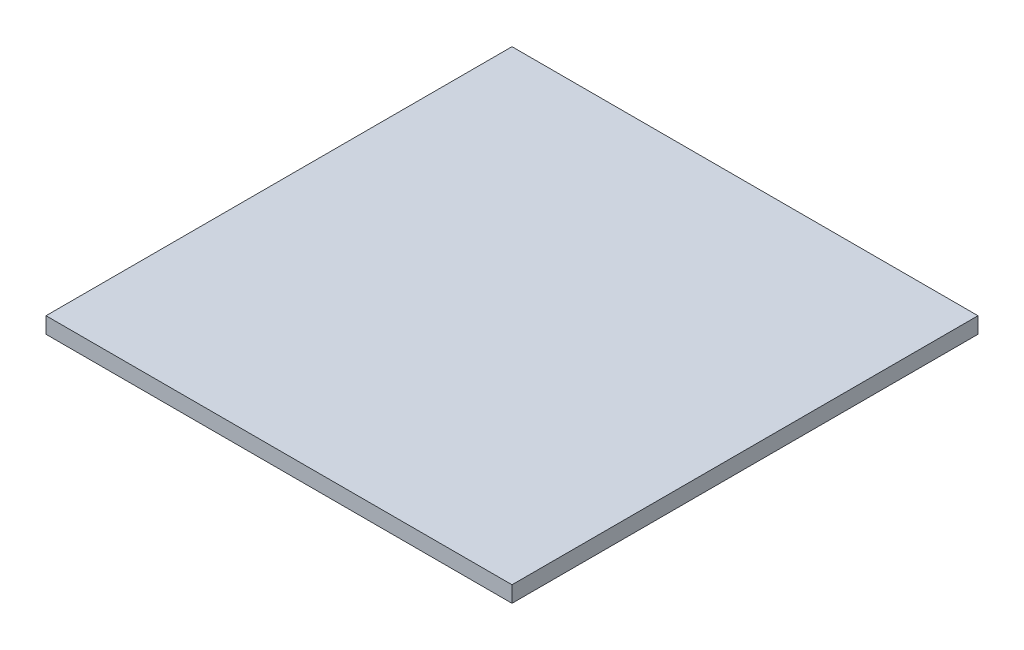
ISO-10303-21;
HEADER;
FILE_DESCRIPTION(('STEP AP214'),'2;1');
FILE_NAME('part.step','',(''),(''),'','','');
FILE_SCHEMA(('AUTOMOTIVE_DESIGN { 1 0 10303 214 1 1 1 1 }'));
ENDSEC;
DATA;
#1=APPLICATION_CONTEXT('core data for automotive mechanical design processes');
#2=APPLICATION_PROTOCOL_DEFINITION('international standard','automotive_design',2000,#1);
#3=PRODUCT_CONTEXT('',#1,'mechanical');
#4=PRODUCT('Part','Part','',(#3));
#5=PRODUCT_RELATED_PRODUCT_CATEGORY('part','',(#4));
#6=PRODUCT_DEFINITION_FORMATION('','',#4);
#7=PRODUCT_DEFINITION_CONTEXT('part definition',#1,'design');
#8=PRODUCT_DEFINITION('design','',#6,#7);
#9=PRODUCT_DEFINITION_SHAPE('','',#8);
#10=(LENGTH_UNIT() NAMED_UNIT(*) SI_UNIT(.MILLI.,.METRE.));
#11=(NAMED_UNIT(*) PLANE_ANGLE_UNIT() SI_UNIT($,.RADIAN.));
#12=(NAMED_UNIT(*) SI_UNIT($,.STERADIAN.) SOLID_ANGLE_UNIT());
#13=UNCERTAINTY_MEASURE_WITH_UNIT(LENGTH_MEASURE(1.E-05),#10,'distance_accuracy_value','');
#14=(GEOMETRIC_REPRESENTATION_CONTEXT(3) GLOBAL_UNCERTAINTY_ASSIGNED_CONTEXT((#13)) GLOBAL_UNIT_ASSIGNED_CONTEXT((#10,
#11,#12)) REPRESENTATION_CONTEXT('',''));
#15=CARTESIAN_POINT('',(0.,0.,0.));
#16=DIRECTION('',(0.,0.,1.));
#17=DIRECTION('',(1.,0.,0.));
#18=AXIS2_PLACEMENT_3D('',#15,#16,#17);
#19=CARTESIAN_POINT('',(-77.216,5.334,-77.216));
#20=DIRECTION('',(1.,0.,0.));
#21=DIRECTION('',(0.,0.,-1.));
#22=AXIS2_PLACEMENT_3D('',#19,#20,#21);
#23=PLANE('',#22);
#24=DIRECTION('',(0.,0.,1.));
#25=VECTOR('',#24,1.);
#26=CARTESIAN_POINT('',(-77.216,0.,-77.216));
#27=LINE('',#26,#25);
#28=CARTESIAN_POINT('',(-77.216,0.,-77.216));
#29=VERTEX_POINT('',#28);
#30=CARTESIAN_POINT('',(-77.216,0.,77.216));
#31=VERTEX_POINT('',#30);
#32=EDGE_CURVE('E96',#29,#31,#27,.T.);
#33=ORIENTED_EDGE('',*,*,#32,.T.);
#34=DIRECTION('',(0.,-1.,0.));
#35=VECTOR('',#34,1.);
#36=CARTESIAN_POINT('',(-77.216,5.334,77.216));
#37=LINE('',#36,#35);
#38=CARTESIAN_POINT('',(-77.216,5.334,77.216));
#39=VERTEX_POINT('',#38);
#40=EDGE_CURVE('E11',#39,#31,#37,.T.);
#41=ORIENTED_EDGE('',*,*,#40,.F.);
#42=DIRECTION('',(0.,0.,1.));
#43=VECTOR('',#42,1.);
#44=CARTESIAN_POINT('',(-77.216,5.334,-77.216));
#45=LINE('',#44,#43);
#46=CARTESIAN_POINT('',(-77.216,5.334,-77.216));
#47=VERTEX_POINT('',#46);
#48=EDGE_CURVE('E84',#47,#39,#45,.T.);
#49=ORIENTED_EDGE('',*,*,#48,.F.);
#50=DIRECTION('',(0.,-1.,0.));
#51=VECTOR('',#50,1.);
#52=CARTESIAN_POINT('',(-77.216,5.334,-77.216));
#53=LINE('',#52,#51);
#54=EDGE_CURVE('E92',#47,#29,#53,.T.);
#55=ORIENTED_EDGE('',*,*,#54,.T.);
#56=EDGE_LOOP('',(#33,#41,#49,#55));
#57=FACE_BOUND('',#56,.T.);
#58=ADVANCED_FACE('F33',(#57),#23,.F.);
#59=CARTESIAN_POINT('',(77.216,5.334,77.216));
#60=DIRECTION('',(0.,0.,-1.));
#61=DIRECTION('',(-1.,0.,0.));
#62=AXIS2_PLACEMENT_3D('',#59,#60,#61);
#63=PLANE('',#62);
#64=DIRECTION('',(1.,0.,0.));
#65=VECTOR('',#64,1.);
#66=CARTESIAN_POINT('',(77.216,0.,77.216));
#67=LINE('',#66,#65);
#68=CARTESIAN_POINT('',(77.216,0.,77.216));
#69=VERTEX_POINT('',#68);
#70=EDGE_CURVE('E88',#31,#69,#67,.T.);
#71=ORIENTED_EDGE('',*,*,#70,.T.);
#72=DIRECTION('',(0.,-1.,0.));
#73=VECTOR('',#72,1.);
#74=CARTESIAN_POINT('',(77.216,5.334,77.216));
#75=LINE('',#74,#73);
#76=CARTESIAN_POINT('',(77.216,5.334,77.216));
#77=VERTEX_POINT('',#76);
#78=EDGE_CURVE('E41',#77,#69,#75,.T.);
#79=ORIENTED_EDGE('',*,*,#78,.F.);
#80=DIRECTION('',(1.,0.,0.));
#81=VECTOR('',#80,1.);
#82=CARTESIAN_POINT('',(77.216,5.334,77.216));
#83=LINE('',#82,#81);
#84=EDGE_CURVE('E79',#39,#77,#83,.T.);
#85=ORIENTED_EDGE('',*,*,#84,.F.);
#86=ORIENTED_EDGE('',*,*,#40,.T.);
#87=EDGE_LOOP('',(#71,#79,#85,#86));
#88=FACE_BOUND('',#87,.T.);
#89=ADVANCED_FACE('F87',(#88),#63,.F.);
#90=CARTESIAN_POINT('',(77.216,5.334,-77.216));
#91=DIRECTION('',(-1.,0.,0.));
#92=DIRECTION('',(0.,0.,1.));
#93=AXIS2_PLACEMENT_3D('',#90,#91,#92);
#94=PLANE('',#93);
#95=DIRECTION('',(0.,0.,-1.));
#96=VECTOR('',#95,1.);
#97=CARTESIAN_POINT('',(77.216,0.,-77.216));
#98=LINE('',#97,#96);
#99=CARTESIAN_POINT('',(77.216,0.,-77.216));
#100=VERTEX_POINT('',#99);
#101=EDGE_CURVE('E66',#69,#100,#98,.T.);
#102=ORIENTED_EDGE('',*,*,#101,.T.);
#103=DIRECTION('',(0.,-1.,0.));
#104=VECTOR('',#103,1.);
#105=CARTESIAN_POINT('',(77.216,5.334,-77.216));
#106=LINE('',#105,#104);
#107=CARTESIAN_POINT('',(77.216,5.334,-77.216));
#108=VERTEX_POINT('',#107);
#109=EDGE_CURVE('E89',#108,#100,#106,.T.);
#110=ORIENTED_EDGE('',*,*,#109,.F.);
#111=DIRECTION('',(0.,0.,-1.));
#112=VECTOR('',#111,1.);
#113=CARTESIAN_POINT('',(77.216,5.334,-77.216));
#114=LINE('',#113,#112);
#115=EDGE_CURVE('E82',#77,#108,#114,.T.);
#116=ORIENTED_EDGE('',*,*,#115,.F.);
#117=ORIENTED_EDGE('',*,*,#78,.T.);
#118=EDGE_LOOP('',(#102,#110,#116,#117));
#119=FACE_BOUND('',#118,.T.);
#120=ADVANCED_FACE('F90',(#119),#94,.F.);
#121=CARTESIAN_POINT('',(77.216,5.334,-77.216));
#122=DIRECTION('',(0.,0.,1.));
#123=DIRECTION('',(1.,0.,0.));
#124=AXIS2_PLACEMENT_3D('',#121,#122,#123);
#125=PLANE('',#124);
#126=DIRECTION('',(-1.,0.,0.));
#127=VECTOR('',#126,1.);
#128=CARTESIAN_POINT('',(77.216,0.,-77.216));
#129=LINE('',#128,#127);
#130=EDGE_CURVE('E72',#100,#29,#129,.T.);
#131=ORIENTED_EDGE('',*,*,#130,.T.);
#132=ORIENTED_EDGE('',*,*,#54,.F.);
#133=DIRECTION('',(-1.,0.,0.));
#134=VECTOR('',#133,1.);
#135=CARTESIAN_POINT('',(77.216,5.334,-77.216));
#136=LINE('',#135,#134);
#137=EDGE_CURVE('E49',#108,#47,#136,.T.);
#138=ORIENTED_EDGE('',*,*,#137,.F.);
#139=ORIENTED_EDGE('',*,*,#109,.T.);
#140=EDGE_LOOP('',(#131,#132,#138,#139));
#141=FACE_BOUND('',#140,.T.);
#142=ADVANCED_FACE('F103',(#141),#125,.F.);
#143=CARTESIAN_POINT('',(-77.216,5.334,77.216));
#144=DIRECTION('',(0.,-1.,0.));
#145=DIRECTION('',(0.,0.,-1.));
#146=AXIS2_PLACEMENT_3D('',#143,#144,#145);
#147=PLANE('',#146);
#148=ORIENTED_EDGE('',*,*,#48,.T.);
#149=ORIENTED_EDGE('',*,*,#84,.T.);
#150=ORIENTED_EDGE('',*,*,#115,.T.);
#151=ORIENTED_EDGE('',*,*,#137,.T.);
#152=EDGE_LOOP('',(#148,#149,#150,#151));
#153=FACE_BOUND('',#152,.T.);
#154=ADVANCED_FACE('F80',(#153),#147,.F.);
#155=CARTESIAN_POINT('',(-77.216,0.,77.216));
#156=DIRECTION('',(0.,-1.,0.));
#157=DIRECTION('',(0.,0.,-1.));
#158=AXIS2_PLACEMENT_3D('',#155,#156,#157);
#159=PLANE('',#158);
#160=ORIENTED_EDGE('',*,*,#32,.F.);
#161=ORIENTED_EDGE('',*,*,#130,.F.);
#162=ORIENTED_EDGE('',*,*,#101,.F.);
#163=ORIENTED_EDGE('',*,*,#70,.F.);
#164=EDGE_LOOP('',(#160,#161,#162,#163));
#165=FACE_BOUND('',#164,.T.);
#166=ADVANCED_FACE('F106',(#165),#159,.T.);
#167=CLOSED_SHELL('',(#58,#89,#120,#142,#154,#166));
#168=MANIFOLD_SOLID_BREP('B2',#167);
#169=ADVANCED_BREP_SHAPE_REPRESENTATION('',(#18,#168),#14);
#170=SHAPE_DEFINITION_REPRESENTATION(#9,#169);
ENDSEC;
END-ISO-10303-21;
